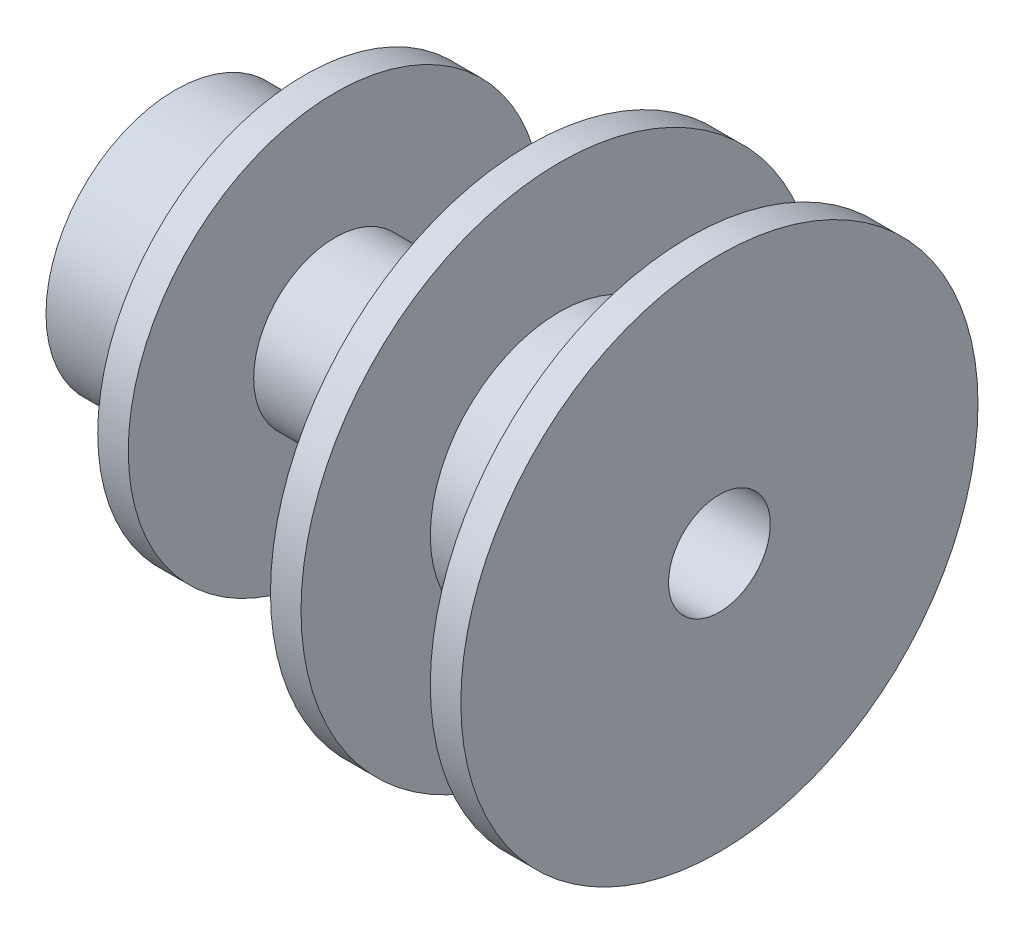
ISO-10303-21;
HEADER;
FILE_DESCRIPTION(('STEP AP214'),'2;1');
FILE_NAME('part.step','',(''),(''),'','','');
FILE_SCHEMA(('AUTOMOTIVE_DESIGN { 1 0 10303 214 1 1 1 1 }'));
ENDSEC;
DATA;
#1=APPLICATION_CONTEXT('core data for automotive mechanical design processes');
#2=APPLICATION_PROTOCOL_DEFINITION('international standard','automotive_design',2000,#1);
#3=PRODUCT_CONTEXT('',#1,'mechanical');
#4=PRODUCT('Part','Part','',(#3));
#5=PRODUCT_RELATED_PRODUCT_CATEGORY('part','',(#4));
#6=PRODUCT_DEFINITION_FORMATION('','',#4);
#7=PRODUCT_DEFINITION_CONTEXT('part definition',#1,'design');
#8=PRODUCT_DEFINITION('design','',#6,#7);
#9=PRODUCT_DEFINITION_SHAPE('','',#8);
#10=(LENGTH_UNIT() NAMED_UNIT(*) SI_UNIT(.MILLI.,.METRE.));
#11=(NAMED_UNIT(*) PLANE_ANGLE_UNIT() SI_UNIT($,.RADIAN.));
#12=(NAMED_UNIT(*) SI_UNIT($,.STERADIAN.) SOLID_ANGLE_UNIT());
#13=UNCERTAINTY_MEASURE_WITH_UNIT(LENGTH_MEASURE(1.E-05),#10,'distance_accuracy_value','');
#14=(GEOMETRIC_REPRESENTATION_CONTEXT(3) GLOBAL_UNCERTAINTY_ASSIGNED_CONTEXT((#13)) GLOBAL_UNIT_ASSIGNED_CONTEXT((#10,
#11,#12)) REPRESENTATION_CONTEXT('',''));
#15=CARTESIAN_POINT('',(0.,0.,0.));
#16=DIRECTION('',(0.,0.,1.));
#17=DIRECTION('',(1.,0.,0.));
#18=AXIS2_PLACEMENT_3D('',#15,#16,#17);
#19=CARTESIAN_POINT('',(-34.75,20.32,0.));
#20=DIRECTION('',(-1.,0.,0.));
#21=DIRECTION('',(0.,0.,1.));
#22=AXIS2_PLACEMENT_3D('',#19,#20,#21);
#23=PLANE('',#22);
#24=CARTESIAN_POINT('',(-34.75,0.,0.));
#25=DIRECTION('',(-1.,0.,0.));
#26=DIRECTION('',(0.,0.,1.));
#27=AXIS2_PLACEMENT_3D('',#24,#25,#26);
#28=CIRCLE('',#27,20.32);
#29=CARTESIAN_POINT('',(-34.75,0.,20.32));
#30=VERTEX_POINT('',#29);
#31=EDGE_CURVE('E10',#30,#30,#28,.T.);
#32=ORIENTED_EDGE('',*,*,#31,.F.);
#33=EDGE_LOOP('',(#32));
#34=FACE_BOUND('',#33,.T.);
#35=CARTESIAN_POINT('',(-34.75,0.,0.));
#36=DIRECTION('',(-1.,0.,0.));
#37=DIRECTION('',(0.,0.,1.));
#38=AXIS2_PLACEMENT_3D('',#35,#36,#37);
#39=CIRCLE('',#38,8.);
#40=CARTESIAN_POINT('',(-34.75,0.,8.));
#41=VERTEX_POINT('',#40);
#42=EDGE_CURVE('E83',#41,#41,#39,.T.);
#43=ORIENTED_EDGE('',*,*,#42,.T.);
#44=EDGE_LOOP('',(#43));
#45=FACE_BOUND('',#44,.T.);
#46=ADVANCED_FACE('F37',(#34,#45),#23,.F.);
#47=CARTESIAN_POINT('',(-93.5714285714284,0.,0.));
#48=DIRECTION('',(-1.,0.,0.));
#49=DIRECTION('',(0.,0.,1.));
#50=AXIS2_PLACEMENT_3D('',#47,#48,#49);
#51=CYLINDRICAL_SURFACE('',#50,20.32);
#52=CARTESIAN_POINT('',(-37.75,0.,0.));
#53=DIRECTION('',(-1.,0.,0.));
#54=DIRECTION('',(0.,0.,1.));
#55=AXIS2_PLACEMENT_3D('',#52,#53,#54);
#56=CIRCLE('',#55,20.32);
#57=CARTESIAN_POINT('',(-37.75,0.,20.32));
#58=VERTEX_POINT('',#57);
#59=EDGE_CURVE('E43',#58,#58,#56,.T.);
#60=ORIENTED_EDGE('',*,*,#59,.F.);
#61=EDGE_LOOP('',(#60));
#62=FACE_BOUND('',#61,.T.);
#63=ORIENTED_EDGE('',*,*,#31,.T.);
#64=EDGE_LOOP('',(#63));
#65=FACE_BOUND('',#64,.T.);
#66=ADVANCED_FACE('F156',(#62,#65),#51,.T.);
#67=CARTESIAN_POINT('',(-37.75,12.7,0.));
#68=DIRECTION('',(1.,0.,0.));
#69=DIRECTION('',(0.,0.,-1.));
#70=AXIS2_PLACEMENT_3D('',#67,#68,#69);
#71=PLANE('',#70);
#72=CARTESIAN_POINT('',(-37.75,0.,0.));
#73=DIRECTION('',(-1.,0.,0.));
#74=DIRECTION('',(0.,0.,1.));
#75=AXIS2_PLACEMENT_3D('',#72,#73,#74);
#76=CIRCLE('',#75,12.7);
#77=CARTESIAN_POINT('',(-37.75,0.,12.7));
#78=VERTEX_POINT('',#77);
#79=EDGE_CURVE('E47',#78,#78,#76,.T.);
#80=ORIENTED_EDGE('',*,*,#79,.F.);
#81=EDGE_LOOP('',(#80));
#82=FACE_BOUND('',#81,.T.);
#83=ORIENTED_EDGE('',*,*,#59,.T.);
#84=EDGE_LOOP('',(#83));
#85=FACE_BOUND('',#84,.T.);
#86=ADVANCED_FACE('F151',(#82,#85),#71,.F.);
#87=CARTESIAN_POINT('',(-93.5714285714284,0.,0.));
#88=DIRECTION('',(-1.,0.,0.));
#89=DIRECTION('',(0.,0.,1.));
#90=AXIS2_PLACEMENT_3D('',#87,#88,#89);
#91=CYLINDRICAL_SURFACE('',#90,12.7);
#92=CARTESIAN_POINT('',(-50.45,0.,0.));
#93=DIRECTION('',(-1.,0.,0.));
#94=DIRECTION('',(0.,0.,1.));
#95=AXIS2_PLACEMENT_3D('',#92,#93,#94);
#96=CIRCLE('',#95,12.7);
#97=CARTESIAN_POINT('',(-50.45,0.,12.7));
#98=VERTEX_POINT('',#97);
#99=EDGE_CURVE('E51',#98,#98,#96,.T.);
#100=ORIENTED_EDGE('',*,*,#99,.F.);
#101=EDGE_LOOP('',(#100));
#102=FACE_BOUND('',#101,.T.);
#103=ORIENTED_EDGE('',*,*,#79,.T.);
#104=EDGE_LOOP('',(#103));
#105=FACE_BOUND('',#104,.T.);
#106=ADVANCED_FACE('F145',(#102,#105),#91,.T.);
#107=CARTESIAN_POINT('',(-50.45,12.7,0.));
#108=DIRECTION('',(1.,0.,0.));
#109=DIRECTION('',(0.,0.,-1.));
#110=AXIS2_PLACEMENT_3D('',#107,#108,#109);
#111=PLANE('',#110);
#112=CARTESIAN_POINT('',(-50.45,0.,0.));
#113=DIRECTION('',(-1.,0.,0.));
#114=DIRECTION('',(0.,0.,1.));
#115=AXIS2_PLACEMENT_3D('',#112,#113,#114);
#116=CIRCLE('',#115,4.99999999999999);
#117=CARTESIAN_POINT('',(-50.45,0.,4.99999999999999));
#118=VERTEX_POINT('',#117);
#119=EDGE_CURVE('E56',#118,#118,#116,.T.);
#120=ORIENTED_EDGE('',*,*,#119,.F.);
#121=EDGE_LOOP('',(#120));
#122=FACE_BOUND('',#121,.T.);
#123=ORIENTED_EDGE('',*,*,#99,.T.);
#124=EDGE_LOOP('',(#123));
#125=FACE_BOUND('',#124,.T.);
#126=ADVANCED_FACE('F139',(#122,#125),#111,.F.);
#127=CARTESIAN_POINT('',(-93.5714285714284,0.,0.));
#128=DIRECTION('',(-1.,0.,0.));
#129=DIRECTION('',(0.,0.,1.));
#130=AXIS2_PLACEMENT_3D('',#127,#128,#129);
#131=CYLINDRICAL_SURFACE('',#130,5.);
#132=CARTESIAN_POINT('',(3.,0.,0.));
#133=DIRECTION('',(-1.,0.,0.));
#134=DIRECTION('',(0.,0.,1.));
#135=AXIS2_PLACEMENT_3D('',#132,#133,#134);
#136=CIRCLE('',#135,5.);
#137=CARTESIAN_POINT('',(3.,0.,5.));
#138=VERTEX_POINT('',#137);
#139=EDGE_CURVE('E59',#138,#138,#136,.T.);
#140=ORIENTED_EDGE('',*,*,#139,.F.);
#141=EDGE_LOOP('',(#140));
#142=FACE_BOUND('',#141,.T.);
#143=ORIENTED_EDGE('',*,*,#119,.T.);
#144=EDGE_LOOP('',(#143));
#145=FACE_BOUND('',#144,.T.);
#146=ADVANCED_FACE('F133',(#142,#145),#131,.F.);
#147=CARTESIAN_POINT('',(3.,25.4,0.));
#148=DIRECTION('',(-1.,0.,0.));
#149=DIRECTION('',(0.,0.,1.));
#150=AXIS2_PLACEMENT_3D('',#147,#148,#149);
#151=PLANE('',#150);
#152=CARTESIAN_POINT('',(3.,0.,0.));
#153=DIRECTION('',(-1.,0.,0.));
#154=DIRECTION('',(0.,0.,1.));
#155=AXIS2_PLACEMENT_3D('',#152,#153,#154);
#156=CIRCLE('',#155,25.4);
#157=CARTESIAN_POINT('',(3.,0.,25.4));
#158=VERTEX_POINT('',#157);
#159=EDGE_CURVE('E62',#158,#158,#156,.T.);
#160=ORIENTED_EDGE('',*,*,#159,.F.);
#161=EDGE_LOOP('',(#160));
#162=FACE_BOUND('',#161,.T.);
#163=ORIENTED_EDGE('',*,*,#139,.T.);
#164=EDGE_LOOP('',(#163));
#165=FACE_BOUND('',#164,.T.);
#166=ADVANCED_FACE('F127',(#162,#165),#151,.F.);
#167=CARTESIAN_POINT('',(-93.5714285714284,0.,0.));
#168=DIRECTION('',(-1.,0.,0.));
#169=DIRECTION('',(0.,0.,1.));
#170=AXIS2_PLACEMENT_3D('',#167,#168,#169);
#171=CYLINDRICAL_SURFACE('',#170,25.4);
#172=CARTESIAN_POINT('',(0.,0.,0.));
#173=DIRECTION('',(-1.,0.,0.));
#174=DIRECTION('',(0.,0.,1.));
#175=AXIS2_PLACEMENT_3D('',#172,#173,#174);
#176=CIRCLE('',#175,25.4);
#177=CARTESIAN_POINT('',(0.,0.,25.4));
#178=VERTEX_POINT('',#177);
#179=EDGE_CURVE('E65',#178,#178,#176,.T.);
#180=ORIENTED_EDGE('',*,*,#179,.F.);
#181=EDGE_LOOP('',(#180));
#182=FACE_BOUND('',#181,.T.);
#183=ORIENTED_EDGE('',*,*,#159,.T.);
#184=EDGE_LOOP('',(#183));
#185=FACE_BOUND('',#184,.T.);
#186=ADVANCED_FACE('F121',(#182,#185),#171,.T.);
#187=CARTESIAN_POINT('',(0.,12.7,0.));
#188=DIRECTION('',(1.,0.,0.));
#189=DIRECTION('',(0.,0.,-1.));
#190=AXIS2_PLACEMENT_3D('',#187,#188,#189);
#191=PLANE('',#190);
#192=CARTESIAN_POINT('',(0.,0.,0.));
#193=DIRECTION('',(-1.,0.,0.));
#194=DIRECTION('',(0.,0.,1.));
#195=AXIS2_PLACEMENT_3D('',#192,#193,#194);
#196=CIRCLE('',#195,12.7);
#197=CARTESIAN_POINT('',(0.,0.,12.7));
#198=VERTEX_POINT('',#197);
#199=EDGE_CURVE('E68',#198,#198,#196,.T.);
#200=ORIENTED_EDGE('',*,*,#199,.F.);
#201=EDGE_LOOP('',(#200));
#202=FACE_BOUND('',#201,.T.);
#203=ORIENTED_EDGE('',*,*,#179,.T.);
#204=EDGE_LOOP('',(#203));
#205=FACE_BOUND('',#204,.T.);
#206=ADVANCED_FACE('F115',(#202,#205),#191,.F.);
#207=CARTESIAN_POINT('',(-93.5714285714284,0.,0.));
#208=DIRECTION('',(-1.,0.,0.));
#209=DIRECTION('',(0.,0.,1.));
#210=AXIS2_PLACEMENT_3D('',#207,#208,#209);
#211=CYLINDRICAL_SURFACE('',#210,12.7);
#212=CARTESIAN_POINT('',(-12.7,0.,0.));
#213=DIRECTION('',(-1.,0.,0.));
#214=DIRECTION('',(0.,0.,1.));
#215=AXIS2_PLACEMENT_3D('',#212,#213,#214);
#216=CIRCLE('',#215,12.7);
#217=CARTESIAN_POINT('',(-12.7,0.,12.7));
#218=VERTEX_POINT('',#217);
#219=EDGE_CURVE('E71',#218,#218,#216,.T.);
#220=ORIENTED_EDGE('',*,*,#219,.F.);
#221=EDGE_LOOP('',(#220));
#222=FACE_BOUND('',#221,.T.);
#223=ORIENTED_EDGE('',*,*,#199,.T.);
#224=EDGE_LOOP('',(#223));
#225=FACE_BOUND('',#224,.T.);
#226=ADVANCED_FACE('F109',(#222,#225),#211,.T.);
#227=CARTESIAN_POINT('',(-12.7,25.4,0.));
#228=DIRECTION('',(-1.,0.,0.));
#229=DIRECTION('',(0.,0.,1.));
#230=AXIS2_PLACEMENT_3D('',#227,#228,#229);
#231=PLANE('',#230);
#232=CARTESIAN_POINT('',(-12.7,0.,0.));
#233=DIRECTION('',(-1.,0.,0.));
#234=DIRECTION('',(0.,0.,1.));
#235=AXIS2_PLACEMENT_3D('',#232,#233,#234);
#236=CIRCLE('',#235,25.4);
#237=CARTESIAN_POINT('',(-12.7,0.,25.4));
#238=VERTEX_POINT('',#237);
#239=EDGE_CURVE('E74',#238,#238,#236,.T.);
#240=ORIENTED_EDGE('',*,*,#239,.F.);
#241=EDGE_LOOP('',(#240));
#242=FACE_BOUND('',#241,.T.);
#243=ORIENTED_EDGE('',*,*,#219,.T.);
#244=EDGE_LOOP('',(#243));
#245=FACE_BOUND('',#244,.T.);
#246=ADVANCED_FACE('F103',(#242,#245),#231,.F.);
#247=CARTESIAN_POINT('',(-93.5714285714284,0.,0.));
#248=DIRECTION('',(-1.,0.,0.));
#249=DIRECTION('',(0.,0.,1.));
#250=AXIS2_PLACEMENT_3D('',#247,#248,#249);
#251=CYLINDRICAL_SURFACE('',#250,25.4);
#252=CARTESIAN_POINT('',(-15.7,0.,0.));
#253=DIRECTION('',(-1.,0.,0.));
#254=DIRECTION('',(0.,0.,1.));
#255=AXIS2_PLACEMENT_3D('',#252,#253,#254);
#256=CIRCLE('',#255,25.4);
#257=CARTESIAN_POINT('',(-15.7,0.,25.4));
#258=VERTEX_POINT('',#257);
#259=EDGE_CURVE('E77',#258,#258,#256,.T.);
#260=ORIENTED_EDGE('',*,*,#259,.F.);
#261=EDGE_LOOP('',(#260));
#262=FACE_BOUND('',#261,.T.);
#263=ORIENTED_EDGE('',*,*,#239,.T.);
#264=EDGE_LOOP('',(#263));
#265=FACE_BOUND('',#264,.T.);
#266=ADVANCED_FACE('F97',(#262,#265),#251,.T.);
#267=CARTESIAN_POINT('',(-15.7,8.,0.));
#268=DIRECTION('',(1.,0.,0.));
#269=DIRECTION('',(0.,0.,-1.));
#270=AXIS2_PLACEMENT_3D('',#267,#268,#269);
#271=PLANE('',#270);
#272=CARTESIAN_POINT('',(-15.7,0.,0.));
#273=DIRECTION('',(-1.,0.,0.));
#274=DIRECTION('',(0.,0.,1.));
#275=AXIS2_PLACEMENT_3D('',#272,#273,#274);
#276=CIRCLE('',#275,8.);
#277=CARTESIAN_POINT('',(-15.7,0.,8.));
#278=VERTEX_POINT('',#277);
#279=EDGE_CURVE('E80',#278,#278,#276,.T.);
#280=ORIENTED_EDGE('',*,*,#279,.F.);
#281=EDGE_LOOP('',(#280));
#282=FACE_BOUND('',#281,.T.);
#283=ORIENTED_EDGE('',*,*,#259,.T.);
#284=EDGE_LOOP('',(#283));
#285=FACE_BOUND('',#284,.T.);
#286=ADVANCED_FACE('F91',(#282,#285),#271,.F.);
#287=CARTESIAN_POINT('',(-93.5714285714284,0.,0.));
#288=DIRECTION('',(-1.,0.,0.));
#289=DIRECTION('',(0.,0.,1.));
#290=AXIS2_PLACEMENT_3D('',#287,#288,#289);
#291=CYLINDRICAL_SURFACE('',#290,8.);
#292=ORIENTED_EDGE('',*,*,#42,.F.);
#293=EDGE_LOOP('',(#292));
#294=FACE_BOUND('',#293,.T.);
#295=ORIENTED_EDGE('',*,*,#279,.T.);
#296=EDGE_LOOP('',(#295));
#297=FACE_BOUND('',#296,.T.);
#298=ADVANCED_FACE('F88',(#294,#297),#291,.T.);
#299=CLOSED_SHELL('',(#46,#66,#86,#106,#126,#146,#166,#186,#206,#226,#246,#266,#286,#298));
#300=MANIFOLD_SOLID_BREP('B2',#299);
#301=ADVANCED_BREP_SHAPE_REPRESENTATION('',(#18,#300),#14);
#302=SHAPE_DEFINITION_REPRESENTATION(#9,#301);
ENDSEC;
END-ISO-10303-21;
